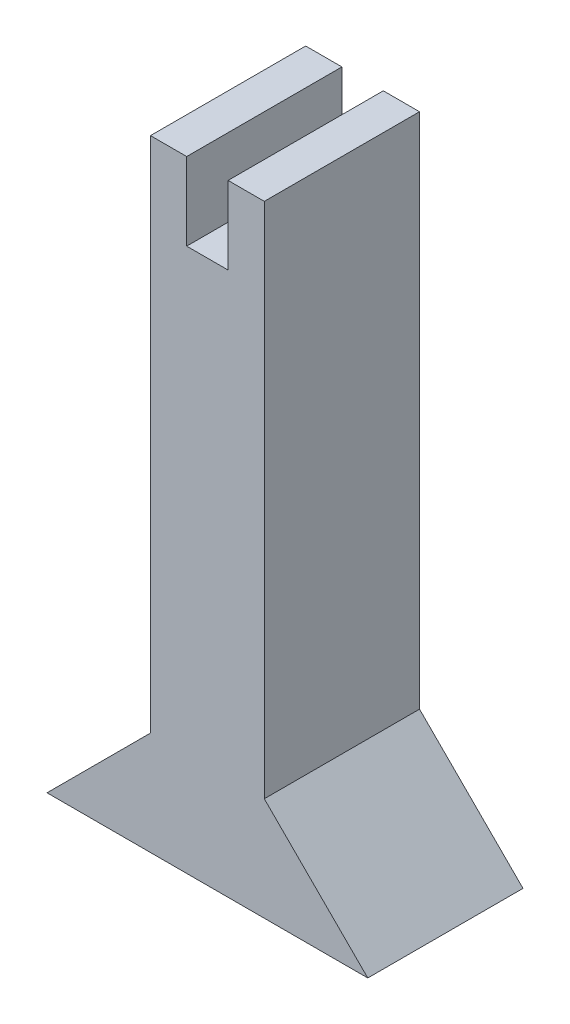
ISO-10303-21;
HEADER;
FILE_DESCRIPTION(('STEP AP214'),'2;1');
FILE_NAME('part.step','',(''),(''),'','','');
FILE_SCHEMA(('AUTOMOTIVE_DESIGN { 1 0 10303 214 1 1 1 1 }'));
ENDSEC;
DATA;
#1=APPLICATION_CONTEXT('core data for automotive mechanical design processes');
#2=APPLICATION_PROTOCOL_DEFINITION('international standard','automotive_design',2000,#1);
#3=PRODUCT_CONTEXT('',#1,'mechanical');
#4=PRODUCT('Part','Part','',(#3));
#5=PRODUCT_RELATED_PRODUCT_CATEGORY('part','',(#4));
#6=PRODUCT_DEFINITION_FORMATION('','',#4);
#7=PRODUCT_DEFINITION_CONTEXT('part definition',#1,'design');
#8=PRODUCT_DEFINITION('design','',#6,#7);
#9=PRODUCT_DEFINITION_SHAPE('','',#8);
#10=(LENGTH_UNIT() NAMED_UNIT(*) SI_UNIT(.MILLI.,.METRE.));
#11=(NAMED_UNIT(*) PLANE_ANGLE_UNIT() SI_UNIT($,.RADIAN.));
#12=(NAMED_UNIT(*) SI_UNIT($,.STERADIAN.) SOLID_ANGLE_UNIT());
#13=UNCERTAINTY_MEASURE_WITH_UNIT(LENGTH_MEASURE(1.E-05),#10,'distance_accuracy_value','');
#14=(GEOMETRIC_REPRESENTATION_CONTEXT(3) GLOBAL_UNCERTAINTY_ASSIGNED_CONTEXT((#13)) GLOBAL_UNIT_ASSIGNED_CONTEXT((#10,
#11,#12)) REPRESENTATION_CONTEXT('',''));
#15=CARTESIAN_POINT('',(0.,0.,0.));
#16=DIRECTION('',(0.,0.,1.));
#17=DIRECTION('',(1.,0.,0.));
#18=AXIS2_PLACEMENT_3D('',#15,#16,#17);
#19=CARTESIAN_POINT('',(15.,15.,30.));
#20=DIRECTION('',(-1.,0.,0.));
#21=DIRECTION('',(0.,-1.,0.));
#22=AXIS2_PLACEMENT_3D('',#19,#20,#21);
#23=PLANE('',#22);
#24=DIRECTION('',(0.,0.,1.));
#25=VECTOR('',#24,1.);
#26=CARTESIAN_POINT('',(15.,-85.,-28.2842712474619));
#27=LINE('',#26,#25);
#28=CARTESIAN_POINT('',(15.,-85.,0.));
#29=VERTEX_POINT('',#28);
#30=CARTESIAN_POINT('',(15.,-85.,30.));
#31=VERTEX_POINT('',#30);
#32=EDGE_CURVE('E56',#29,#31,#27,.T.);
#33=ORIENTED_EDGE('',*,*,#32,.F.);
#34=DIRECTION('',(0.,1.,0.));
#35=VECTOR('',#34,1.);
#36=CARTESIAN_POINT('',(15.,15.,0.));
#37=LINE('',#36,#35);
#38=CARTESIAN_POINT('',(15.,15.,0.));
#39=VERTEX_POINT('',#38);
#40=EDGE_CURVE('E167',#29,#39,#37,.T.);
#41=ORIENTED_EDGE('',*,*,#40,.T.);
#42=DIRECTION('',(0.,0.,-1.));
#43=VECTOR('',#42,1.);
#44=CARTESIAN_POINT('',(15.,15.,30.));
#45=LINE('',#44,#43);
#46=CARTESIAN_POINT('',(15.,15.,30.));
#47=VERTEX_POINT('',#46);
#48=EDGE_CURVE('E182',#47,#39,#45,.T.);
#49=ORIENTED_EDGE('',*,*,#48,.F.);
#50=DIRECTION('',(0.,1.,0.));
#51=VECTOR('',#50,1.);
#52=CARTESIAN_POINT('',(15.,15.,30.));
#53=LINE('',#52,#51);
#54=EDGE_CURVE('E121',#31,#47,#53,.T.);
#55=ORIENTED_EDGE('',*,*,#54,.F.);
#56=EDGE_LOOP('',(#33,#41,#49,#55));
#57=FACE_BOUND('',#56,.T.);
#58=ADVANCED_FACE('F33',(#57),#23,.F.);
#59=CARTESIAN_POINT('',(0.,0.,30.));
#60=DIRECTION('',(-1.,0.,0.));
#61=DIRECTION('',(0.,0.,1.));
#62=AXIS2_PLACEMENT_3D('',#59,#60,#61);
#63=PLANE('',#62);
#64=DIRECTION('',(0.,1.,0.));
#65=VECTOR('',#64,1.);
#66=CARTESIAN_POINT('',(0.,0.,0.));
#67=LINE('',#66,#65);
#68=CARTESIAN_POINT('',(0.,0.,0.));
#69=VERTEX_POINT('',#68);
#70=CARTESIAN_POINT('',(0.,15.,0.));
#71=VERTEX_POINT('',#70);
#72=EDGE_CURVE('E140',#69,#71,#67,.T.);
#73=ORIENTED_EDGE('',*,*,#72,.T.);
#74=DIRECTION('',(0.,0.,-1.));
#75=VECTOR('',#74,1.);
#76=CARTESIAN_POINT('',(0.,15.,30.));
#77=LINE('',#76,#75);
#78=CARTESIAN_POINT('',(0.,15.,30.));
#79=VERTEX_POINT('',#78);
#80=EDGE_CURVE('E11',#79,#71,#77,.T.);
#81=ORIENTED_EDGE('',*,*,#80,.F.);
#82=DIRECTION('',(0.,1.,0.));
#83=VECTOR('',#82,1.);
#84=CARTESIAN_POINT('',(0.,0.,30.));
#85=LINE('',#84,#83);
#86=CARTESIAN_POINT('',(0.,0.,30.));
#87=VERTEX_POINT('',#86);
#88=EDGE_CURVE('E144',#87,#79,#85,.T.);
#89=ORIENTED_EDGE('',*,*,#88,.F.);
#90=DIRECTION('',(0.,0.,-1.));
#91=VECTOR('',#90,1.);
#92=CARTESIAN_POINT('',(0.,0.,30.));
#93=LINE('',#92,#91);
#94=EDGE_CURVE('E157',#87,#69,#93,.T.);
#95=ORIENTED_EDGE('',*,*,#94,.T.);
#96=EDGE_LOOP('',(#73,#81,#89,#95));
#97=FACE_BOUND('',#96,.T.);
#98=ADVANCED_FACE('F35',(#97),#63,.F.);
#99=CARTESIAN_POINT('',(0.,15.,30.));
#100=DIRECTION('',(0.,-1.,0.));
#101=DIRECTION('',(0.,0.,-1.));
#102=AXIS2_PLACEMENT_3D('',#99,#100,#101);
#103=PLANE('',#102);
#104=DIRECTION('',(-1.,0.,0.));
#105=VECTOR('',#104,1.);
#106=CARTESIAN_POINT('',(0.,15.,0.));
#107=LINE('',#106,#105);
#108=CARTESIAN_POINT('',(-7.,15.,0.));
#109=VERTEX_POINT('',#108);
#110=EDGE_CURVE('E160',#71,#109,#107,.T.);
#111=ORIENTED_EDGE('',*,*,#110,.T.);
#112=DIRECTION('',(0.,0.,-1.));
#113=VECTOR('',#112,1.);
#114=CARTESIAN_POINT('',(-7.,15.,30.));
#115=LINE('',#114,#113);
#116=CARTESIAN_POINT('',(-7.,15.,30.));
#117=VERTEX_POINT('',#116);
#118=EDGE_CURVE('E41',#117,#109,#115,.T.);
#119=ORIENTED_EDGE('',*,*,#118,.F.);
#120=DIRECTION('',(-1.,0.,0.));
#121=VECTOR('',#120,1.);
#122=CARTESIAN_POINT('',(0.,15.,30.));
#123=LINE('',#122,#121);
#124=EDGE_CURVE('E146',#79,#117,#123,.T.);
#125=ORIENTED_EDGE('',*,*,#124,.F.);
#126=ORIENTED_EDGE('',*,*,#80,.T.);
#127=EDGE_LOOP('',(#111,#119,#125,#126));
#128=FACE_BOUND('',#127,.T.);
#129=ADVANCED_FACE('F215',(#128),#103,.F.);
#130=CARTESIAN_POINT('',(-7.,15.,30.));
#131=DIRECTION('',(1.,0.,0.));
#132=DIRECTION('',(0.,1.,0.));
#133=AXIS2_PLACEMENT_3D('',#130,#131,#132);
#134=PLANE('',#133);
#135=DIRECTION('',(0.,-1.,0.));
#136=VECTOR('',#135,1.);
#137=CARTESIAN_POINT('',(-7.,15.,0.));
#138=LINE('',#137,#136);
#139=CARTESIAN_POINT('',(-6.99999999999999,-85.,0.));
#140=VERTEX_POINT('',#139);
#141=EDGE_CURVE('E162',#109,#140,#138,.T.);
#142=ORIENTED_EDGE('',*,*,#141,.T.);
#143=DIRECTION('',(0.,0.,1.));
#144=VECTOR('',#143,1.);
#145=CARTESIAN_POINT('',(-6.99999999999999,-85.,-28.2842712474619));
#146=LINE('',#145,#144);
#147=CARTESIAN_POINT('',(-6.99999999999999,-85.,30.));
#148=VERTEX_POINT('',#147);
#149=EDGE_CURVE('E126',#140,#148,#146,.T.);
#150=ORIENTED_EDGE('',*,*,#149,.T.);
#151=DIRECTION('',(0.,-1.,0.));
#152=VECTOR('',#151,1.);
#153=CARTESIAN_POINT('',(-7.,15.,30.));
#154=LINE('',#153,#152);
#155=EDGE_CURVE('E122',#117,#148,#154,.T.);
#156=ORIENTED_EDGE('',*,*,#155,.F.);
#157=ORIENTED_EDGE('',*,*,#118,.T.);
#158=EDGE_LOOP('',(#142,#150,#156,#157));
#159=FACE_BOUND('',#158,.T.);
#160=ADVANCED_FACE('F188',(#159),#134,.F.);
#161=CARTESIAN_POINT('',(-6.99999999999999,-105.,30.));
#162=DIRECTION('',(0.,1.,0.));
#163=DIRECTION('',(0.,0.,1.));
#164=AXIS2_PLACEMENT_3D('',#161,#162,#163);
#165=PLANE('',#164);
#166=DIRECTION('',(1.,0.,0.));
#167=VECTOR('',#166,1.);
#168=CARTESIAN_POINT('',(-6.99999999999999,-105.,0.));
#169=LINE('',#168,#167);
#170=CARTESIAN_POINT('',(-27.,-105.,0.));
#171=VERTEX_POINT('',#170);
#172=CARTESIAN_POINT('',(35.,-105.,0.));
#173=VERTEX_POINT('',#172);
#174=EDGE_CURVE('E165',#171,#173,#169,.T.);
#175=ORIENTED_EDGE('',*,*,#174,.T.);
#176=DIRECTION('',(0.,0.,1.));
#177=VECTOR('',#176,1.);
#178=CARTESIAN_POINT('',(35.,-105.,-28.2842712474619));
#179=LINE('',#178,#177);
#180=CARTESIAN_POINT('',(35.,-105.,30.));
#181=VERTEX_POINT('',#180);
#182=EDGE_CURVE('E117',#173,#181,#179,.T.);
#183=ORIENTED_EDGE('',*,*,#182,.T.);
#184=DIRECTION('',(1.,0.,0.));
#185=VECTOR('',#184,1.);
#186=CARTESIAN_POINT('',(-6.99999999999999,-105.,30.));
#187=LINE('',#186,#185);
#188=CARTESIAN_POINT('',(-27.,-105.,30.));
#189=VERTEX_POINT('',#188);
#190=EDGE_CURVE('E112',#189,#181,#187,.T.);
#191=ORIENTED_EDGE('',*,*,#190,.F.);
#192=DIRECTION('',(0.,0.,1.));
#193=VECTOR('',#192,1.);
#194=CARTESIAN_POINT('',(-27.,-105.,-28.2842712474619));
#195=LINE('',#194,#193);
#196=EDGE_CURVE('E114',#171,#189,#195,.T.);
#197=ORIENTED_EDGE('',*,*,#196,.F.);
#198=EDGE_LOOP('',(#175,#183,#191,#197));
#199=FACE_BOUND('',#198,.T.);
#200=ADVANCED_FACE('F113',(#199),#165,.F.);
#201=CARTESIAN_POINT('',(8.,15.,30.));
#202=DIRECTION('',(0.,-1.,0.));
#203=DIRECTION('',(0.,0.,-1.));
#204=AXIS2_PLACEMENT_3D('',#201,#202,#203);
#205=PLANE('',#204);
#206=DIRECTION('',(-1.,0.,0.));
#207=VECTOR('',#206,1.);
#208=CARTESIAN_POINT('',(8.,15.,0.));
#209=LINE('',#208,#207);
#210=CARTESIAN_POINT('',(8.,15.,0.));
#211=VERTEX_POINT('',#210);
#212=EDGE_CURVE('E169',#39,#211,#209,.T.);
#213=ORIENTED_EDGE('',*,*,#212,.T.);
#214=DIRECTION('',(0.,0.,-1.));
#215=VECTOR('',#214,1.);
#216=CARTESIAN_POINT('',(8.,15.,30.));
#217=LINE('',#216,#215);
#218=CARTESIAN_POINT('',(8.,15.,30.));
#219=VERTEX_POINT('',#218);
#220=EDGE_CURVE('E179',#219,#211,#217,.T.);
#221=ORIENTED_EDGE('',*,*,#220,.F.);
#222=DIRECTION('',(-1.,0.,0.));
#223=VECTOR('',#222,1.);
#224=CARTESIAN_POINT('',(8.,15.,30.));
#225=LINE('',#224,#223);
#226=EDGE_CURVE('E151',#47,#219,#225,.T.);
#227=ORIENTED_EDGE('',*,*,#226,.F.);
#228=ORIENTED_EDGE('',*,*,#48,.T.);
#229=EDGE_LOOP('',(#213,#221,#227,#228));
#230=FACE_BOUND('',#229,.T.);
#231=ADVANCED_FACE('F201',(#230),#205,.F.);
#232=CARTESIAN_POINT('',(8.,0.,30.));
#233=DIRECTION('',(1.,0.,0.));
#234=DIRECTION('',(0.,0.,-1.));
#235=AXIS2_PLACEMENT_3D('',#232,#233,#234);
#236=PLANE('',#235);
#237=DIRECTION('',(0.,-1.,0.));
#238=VECTOR('',#237,1.);
#239=CARTESIAN_POINT('',(8.,0.,0.));
#240=LINE('',#239,#238);
#241=CARTESIAN_POINT('',(8.,0.,0.));
#242=VERTEX_POINT('',#241);
#243=EDGE_CURVE('E171',#211,#242,#240,.T.);
#244=ORIENTED_EDGE('',*,*,#243,.T.);
#245=DIRECTION('',(0.,0.,-1.));
#246=VECTOR('',#245,1.);
#247=CARTESIAN_POINT('',(8.,0.,30.));
#248=LINE('',#247,#246);
#249=CARTESIAN_POINT('',(8.,0.,30.));
#250=VERTEX_POINT('',#249);
#251=EDGE_CURVE('E176',#250,#242,#248,.T.);
#252=ORIENTED_EDGE('',*,*,#251,.F.);
#253=DIRECTION('',(0.,-1.,0.));
#254=VECTOR('',#253,1.);
#255=CARTESIAN_POINT('',(8.,0.,30.));
#256=LINE('',#255,#254);
#257=EDGE_CURVE('E153',#219,#250,#256,.T.);
#258=ORIENTED_EDGE('',*,*,#257,.F.);
#259=ORIENTED_EDGE('',*,*,#220,.T.);
#260=EDGE_LOOP('',(#244,#252,#258,#259));
#261=FACE_BOUND('',#260,.T.);
#262=ADVANCED_FACE('F206',(#261),#236,.F.);
#263=CARTESIAN_POINT('',(0.,0.,30.));
#264=DIRECTION('',(0.,-1.,0.));
#265=DIRECTION('',(0.,0.,-1.));
#266=AXIS2_PLACEMENT_3D('',#263,#264,#265);
#267=PLANE('',#266);
#268=DIRECTION('',(-1.,0.,0.));
#269=VECTOR('',#268,1.);
#270=CARTESIAN_POINT('',(0.,0.,0.));
#271=LINE('',#270,#269);
#272=EDGE_CURVE('E147',#242,#69,#271,.T.);
#273=ORIENTED_EDGE('',*,*,#272,.T.);
#274=ORIENTED_EDGE('',*,*,#94,.F.);
#275=DIRECTION('',(-1.,0.,0.));
#276=VECTOR('',#275,1.);
#277=CARTESIAN_POINT('',(0.,0.,30.));
#278=LINE('',#277,#276);
#279=EDGE_CURVE('E155',#250,#87,#278,.T.);
#280=ORIENTED_EDGE('',*,*,#279,.F.);
#281=ORIENTED_EDGE('',*,*,#251,.T.);
#282=EDGE_LOOP('',(#273,#274,#280,#281));
#283=FACE_BOUND('',#282,.T.);
#284=ADVANCED_FACE('F212',(#283),#267,.F.);
#285=CARTESIAN_POINT('',(0.,0.,30.));
#286=DIRECTION('',(0.,0.,1.));
#287=DIRECTION('',(1.,0.,0.));
#288=AXIS2_PLACEMENT_3D('',#285,#286,#287);
#289=PLANE('',#288);
#290=ORIENTED_EDGE('',*,*,#88,.T.);
#291=ORIENTED_EDGE('',*,*,#124,.T.);
#292=ORIENTED_EDGE('',*,*,#155,.T.);
#293=DIRECTION('',(0.707106781186548,0.707106781186548,0.));
#294=VECTOR('',#293,1.);
#295=CARTESIAN_POINT('',(-6.99999999999999,-85.,30.));
#296=LINE('',#295,#294);
#297=EDGE_CURVE('E48',#189,#148,#296,.T.);
#298=ORIENTED_EDGE('',*,*,#297,.F.);
#299=ORIENTED_EDGE('',*,*,#190,.T.);
#300=DIRECTION('',(-0.707106781186548,0.707106781186548,0.));
#301=VECTOR('',#300,1.);
#302=CARTESIAN_POINT('',(15.,-85.,30.));
#303=LINE('',#302,#301);
#304=EDGE_CURVE('E136',#181,#31,#303,.T.);
#305=ORIENTED_EDGE('',*,*,#304,.T.);
#306=ORIENTED_EDGE('',*,*,#54,.T.);
#307=ORIENTED_EDGE('',*,*,#226,.T.);
#308=ORIENTED_EDGE('',*,*,#257,.T.);
#309=ORIENTED_EDGE('',*,*,#279,.T.);
#310=EDGE_LOOP('',(#290,#291,#292,#298,#299,#305,#306,#307,#308,#309));
#311=FACE_BOUND('',#310,.T.);
#312=ADVANCED_FACE('F130',(#311),#289,.T.);
#313=CARTESIAN_POINT('',(0.,0.,0.));
#314=DIRECTION('',(0.,0.,1.));
#315=DIRECTION('',(1.,0.,0.));
#316=AXIS2_PLACEMENT_3D('',#313,#314,#315);
#317=PLANE('',#316);
#318=ORIENTED_EDGE('',*,*,#72,.F.);
#319=ORIENTED_EDGE('',*,*,#272,.F.);
#320=ORIENTED_EDGE('',*,*,#243,.F.);
#321=ORIENTED_EDGE('',*,*,#212,.F.);
#322=ORIENTED_EDGE('',*,*,#40,.F.);
#323=DIRECTION('',(0.707106781186548,-0.707106781186548,0.));
#324=VECTOR('',#323,1.);
#325=CARTESIAN_POINT('',(15.,-85.,0.));
#326=LINE('',#325,#324);
#327=EDGE_CURVE('E137',#29,#173,#326,.T.);
#328=ORIENTED_EDGE('',*,*,#327,.T.);
#329=ORIENTED_EDGE('',*,*,#174,.F.);
#330=DIRECTION('',(-0.707106781186548,-0.707106781186548,0.));
#331=VECTOR('',#330,1.);
#332=CARTESIAN_POINT('',(-6.99999999999999,-85.,0.));
#333=LINE('',#332,#331);
#334=EDGE_CURVE('E125',#140,#171,#333,.T.);
#335=ORIENTED_EDGE('',*,*,#334,.F.);
#336=ORIENTED_EDGE('',*,*,#141,.F.);
#337=ORIENTED_EDGE('',*,*,#110,.F.);
#338=EDGE_LOOP('',(#318,#319,#320,#321,#322,#328,#329,#335,#336,#337));
#339=FACE_BOUND('',#338,.T.);
#340=ADVANCED_FACE('F192',(#339),#317,.F.);
#341=CARTESIAN_POINT('',(15.,-85.,-28.2842712474619));
#342=DIRECTION('',(0.707106781186548,0.707106781186548,0.));
#343=DIRECTION('',(-0.707106781186548,0.707106781186548,0.));
#344=AXIS2_PLACEMENT_3D('',#341,#342,#343);
#345=PLANE('',#344);
#346=ORIENTED_EDGE('',*,*,#327,.F.);
#347=ORIENTED_EDGE('',*,*,#32,.T.);
#348=ORIENTED_EDGE('',*,*,#304,.F.);
#349=ORIENTED_EDGE('',*,*,#182,.F.);
#350=EDGE_LOOP('',(#346,#347,#348,#349));
#351=FACE_BOUND('',#350,.T.);
#352=ADVANCED_FACE('F196',(#351),#345,.T.);
#353=CARTESIAN_POINT('',(-6.99999999999999,-85.,-28.2842712474619));
#354=DIRECTION('',(0.707106781186548,-0.707106781186548,0.));
#355=DIRECTION('',(0.707106781186548,0.707106781186548,0.));
#356=AXIS2_PLACEMENT_3D('',#353,#354,#355);
#357=PLANE('',#356);
#358=ORIENTED_EDGE('',*,*,#149,.F.);
#359=ORIENTED_EDGE('',*,*,#334,.T.);
#360=ORIENTED_EDGE('',*,*,#196,.T.);
#361=ORIENTED_EDGE('',*,*,#297,.T.);
#362=EDGE_LOOP('',(#358,#359,#360,#361));
#363=FACE_BOUND('',#362,.T.);
#364=ADVANCED_FACE('F124',(#363),#357,.F.);
#365=CLOSED_SHELL('',(#58,#98,#129,#160,#200,#231,#262,#284,#312,#340,#352,#364));
#366=MANIFOLD_SOLID_BREP('B2',#365);
#367=ADVANCED_BREP_SHAPE_REPRESENTATION('',(#18,#366),#14);
#368=SHAPE_DEFINITION_REPRESENTATION(#9,#367);
ENDSEC;
END-ISO-10303-21;
